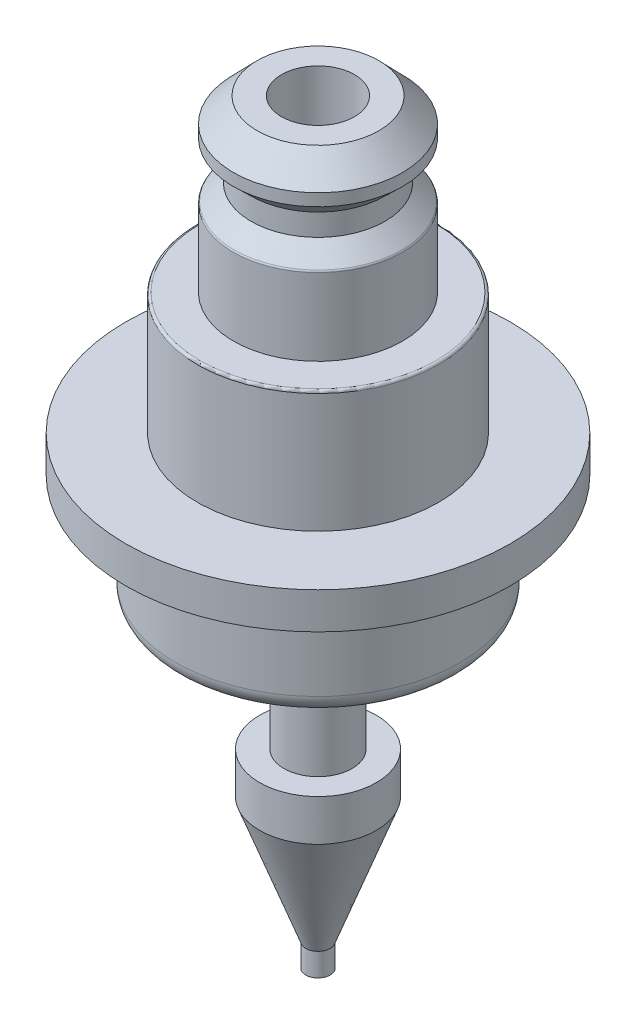
ISO-10303-21;
HEADER;
FILE_DESCRIPTION(('STEP AP214'),'2;1');
FILE_NAME('part.step','',(''),(''),'','','');
FILE_SCHEMA(('AUTOMOTIVE_DESIGN { 1 0 10303 214 1 1 1 1 }'));
ENDSEC;
DATA;
#1=APPLICATION_CONTEXT('core data for automotive mechanical design processes');
#2=APPLICATION_PROTOCOL_DEFINITION('international standard','automotive_design',2000,#1);
#3=PRODUCT_CONTEXT('',#1,'mechanical');
#4=PRODUCT('Part','Part','',(#3));
#5=PRODUCT_RELATED_PRODUCT_CATEGORY('part','',(#4));
#6=PRODUCT_DEFINITION_FORMATION('','',#4);
#7=PRODUCT_DEFINITION_CONTEXT('part definition',#1,'design');
#8=PRODUCT_DEFINITION('design','',#6,#7);
#9=PRODUCT_DEFINITION_SHAPE('','',#8);
#10=(LENGTH_UNIT() NAMED_UNIT(*) SI_UNIT(.MILLI.,.METRE.));
#11=(NAMED_UNIT(*) PLANE_ANGLE_UNIT() SI_UNIT($,.RADIAN.));
#12=(NAMED_UNIT(*) SI_UNIT($,.STERADIAN.) SOLID_ANGLE_UNIT());
#13=UNCERTAINTY_MEASURE_WITH_UNIT(LENGTH_MEASURE(1.E-05),#10,'distance_accuracy_value','');
#14=(GEOMETRIC_REPRESENTATION_CONTEXT(3) GLOBAL_UNCERTAINTY_ASSIGNED_CONTEXT((#13)) GLOBAL_UNIT_ASSIGNED_CONTEXT((#10,
#11,#12)) REPRESENTATION_CONTEXT('',''));
#15=CARTESIAN_POINT('',(0.,0.,0.));
#16=DIRECTION('',(0.,0.,1.));
#17=DIRECTION('',(1.,0.,0.));
#18=AXIS2_PLACEMENT_3D('',#15,#16,#17);
#19=CARTESIAN_POINT('',(0.,13.5,0.));
#20=DIRECTION('',(0.,-1.,0.));
#21=DIRECTION('',(1.,0.,0.));
#22=AXIS2_PLACEMENT_3D('',#19,#20,#21);
#23=CYLINDRICAL_SURFACE('',#22,2.39999999999999);
#24=CARTESIAN_POINT('',(0.,-9.75000000000001,0.));
#25=DIRECTION('',(0.,-1.,0.));
#26=DIRECTION('',(1.,0.,0.));
#27=AXIS2_PLACEMENT_3D('',#24,#25,#26);
#28=CIRCLE('',#27,2.39999999999999);
#29=CARTESIAN_POINT('',(2.39999999999999,-9.75000000000001,0.));
#30=VERTEX_POINT('',#29);
#31=EDGE_CURVE('E47',#30,#30,#28,.T.);
#32=ORIENTED_EDGE('',*,*,#31,.T.);
#33=EDGE_LOOP('',(#32));
#34=FACE_BOUND('',#33,.T.);
#35=CARTESIAN_POINT('',(0.,-11.45,0.));
#36=DIRECTION('',(0.,-1.,0.));
#37=DIRECTION('',(1.,0.,0.));
#38=AXIS2_PLACEMENT_3D('',#35,#36,#37);
#39=CIRCLE('',#38,2.39999999999999);
#40=CARTESIAN_POINT('',(-2.39999999999998,-11.45,0.));
#41=VERTEX_POINT('',#40);
#42=EDGE_CURVE('E117',#41,#41,#39,.T.);
#43=ORIENTED_EDGE('',*,*,#42,.F.);
#44=EDGE_LOOP('',(#43));
#45=FACE_BOUND('',#44,.T.);
#46=ADVANCED_FACE('F41',(#34,#45),#23,.T.);
#47=CARTESIAN_POINT('',(2.39999999999999,-9.75000000000001,0.));
#48=DIRECTION('',(0.,1.,0.));
#49=DIRECTION('',(-1.,0.,0.));
#50=AXIS2_PLACEMENT_3D('',#47,#48,#49);
#51=PLANE('',#50);
#52=CARTESIAN_POINT('',(0.,-9.75000000000001,0.));
#53=DIRECTION('',(0.,-1.,0.));
#54=DIRECTION('',(1.,0.,0.));
#55=AXIS2_PLACEMENT_3D('',#52,#53,#54);
#56=CIRCLE('',#55,1.4);
#57=CARTESIAN_POINT('',(1.4,-9.75000000000001,0.));
#58=VERTEX_POINT('',#57);
#59=EDGE_CURVE('E51',#58,#58,#56,.T.);
#60=ORIENTED_EDGE('',*,*,#59,.T.);
#61=EDGE_LOOP('',(#60));
#62=FACE_BOUND('',#61,.T.);
#63=ORIENTED_EDGE('',*,*,#31,.F.);
#64=EDGE_LOOP('',(#63));
#65=FACE_BOUND('',#64,.T.);
#66=ADVANCED_FACE('F146',(#62,#65),#51,.T.);
#67=CARTESIAN_POINT('',(0.,13.5,0.));
#68=DIRECTION('',(0.,-1.,0.));
#69=DIRECTION('',(1.,0.,0.));
#70=AXIS2_PLACEMENT_3D('',#67,#68,#69);
#71=CYLINDRICAL_SURFACE('',#70,1.4);
#72=CARTESIAN_POINT('',(0.,-4.5,0.));
#73=DIRECTION('',(0.,-1.,0.));
#74=DIRECTION('',(1.,0.,0.));
#75=AXIS2_PLACEMENT_3D('',#72,#73,#74);
#76=CIRCLE('',#75,1.4);
#77=CARTESIAN_POINT('',(1.4,-4.5,0.));
#78=VERTEX_POINT('',#77);
#79=EDGE_CURVE('E55',#78,#78,#76,.T.);
#80=ORIENTED_EDGE('',*,*,#79,.T.);
#81=EDGE_LOOP('',(#80));
#82=FACE_BOUND('',#81,.T.);
#83=ORIENTED_EDGE('',*,*,#59,.F.);
#84=EDGE_LOOP('',(#83));
#85=FACE_BOUND('',#84,.T.);
#86=ADVANCED_FACE('F150',(#82,#85),#71,.T.);
#87=CARTESIAN_POINT('',(1.4,-4.5,0.));
#88=DIRECTION('',(0.,-1.,0.));
#89=DIRECTION('',(1.,0.,0.));
#90=AXIS2_PLACEMENT_3D('',#87,#88,#89);
#91=PLANE('',#90);
#92=CARTESIAN_POINT('',(0.,-4.5,0.));
#93=DIRECTION('',(0.,-1.,0.));
#94=DIRECTION('',(1.,0.,0.));
#95=AXIS2_PLACEMENT_3D('',#92,#93,#94);
#96=CIRCLE('',#95,5.1);
#97=CARTESIAN_POINT('',(5.1,-4.5,0.));
#98=VERTEX_POINT('',#97);
#99=EDGE_CURVE('E60',#98,#98,#96,.T.);
#100=ORIENTED_EDGE('',*,*,#99,.T.);
#101=EDGE_LOOP('',(#100));
#102=FACE_BOUND('',#101,.T.);
#103=ORIENTED_EDGE('',*,*,#79,.F.);
#104=EDGE_LOOP('',(#103));
#105=FACE_BOUND('',#104,.T.);
#106=ADVANCED_FACE('F158',(#102,#105),#91,.T.);
#107=CARTESIAN_POINT('',(0.,-3.75,0.));
#108=DIRECTION('',(0.,-1.,0.));
#109=DIRECTION('',(1.,0.,0.));
#110=AXIS2_PLACEMENT_3D('',#107,#108,#109);
#111=TOROIDAL_SURFACE('',#110,5.1,0.75);
#112=CARTESIAN_POINT('',(0.,-3.75,0.));
#113=DIRECTION('',(0.,-1.,0.));
#114=DIRECTION('',(1.,0.,0.));
#115=AXIS2_PLACEMENT_3D('',#112,#113,#114);
#116=CIRCLE('',#115,5.85);
#117=CARTESIAN_POINT('',(5.85,-3.75,0.));
#118=VERTEX_POINT('',#117);
#119=EDGE_CURVE('E63',#118,#118,#116,.T.);
#120=ORIENTED_EDGE('',*,*,#119,.T.);
#121=EDGE_LOOP('',(#120));
#122=FACE_BOUND('',#121,.T.);
#123=ORIENTED_EDGE('',*,*,#99,.F.);
#124=EDGE_LOOP('',(#123));
#125=FACE_BOUND('',#124,.T.);
#126=ADVANCED_FACE('F165',(#122,#125),#111,.T.);
#127=CARTESIAN_POINT('',(0.,13.5,0.));
#128=DIRECTION('',(0.,-1.,0.));
#129=DIRECTION('',(1.,0.,0.));
#130=AXIS2_PLACEMENT_3D('',#127,#128,#129);
#131=CYLINDRICAL_SURFACE('',#130,5.85);
#132=CARTESIAN_POINT('',(0.,0.,0.));
#133=DIRECTION('',(0.,-1.,0.));
#134=DIRECTION('',(1.,0.,0.));
#135=AXIS2_PLACEMENT_3D('',#132,#133,#134);
#136=CIRCLE('',#135,5.85);
#137=CARTESIAN_POINT('',(5.85,0.,0.));
#138=VERTEX_POINT('',#137);
#139=EDGE_CURVE('E66',#138,#138,#136,.T.);
#140=ORIENTED_EDGE('',*,*,#139,.T.);
#141=EDGE_LOOP('',(#140));
#142=FACE_BOUND('',#141,.T.);
#143=ORIENTED_EDGE('',*,*,#119,.F.);
#144=EDGE_LOOP('',(#143));
#145=FACE_BOUND('',#144,.T.);
#146=ADVANCED_FACE('F169',(#142,#145),#131,.T.);
#147=CARTESIAN_POINT('',(5.85,0.,0.));
#148=DIRECTION('',(0.,-1.,0.));
#149=DIRECTION('',(1.,0.,0.));
#150=AXIS2_PLACEMENT_3D('',#147,#148,#149);
#151=PLANE('',#150);
#152=CARTESIAN_POINT('',(0.,0.,0.));
#153=DIRECTION('',(0.,-1.,0.));
#154=DIRECTION('',(1.,0.,0.));
#155=AXIS2_PLACEMENT_3D('',#152,#153,#154);
#156=CIRCLE('',#155,7.9);
#157=CARTESIAN_POINT('',(7.9,0.,0.));
#158=VERTEX_POINT('',#157);
#159=EDGE_CURVE('E69',#158,#158,#156,.T.);
#160=ORIENTED_EDGE('',*,*,#159,.T.);
#161=EDGE_LOOP('',(#160));
#162=FACE_BOUND('',#161,.T.);
#163=ORIENTED_EDGE('',*,*,#139,.F.);
#164=EDGE_LOOP('',(#163));
#165=FACE_BOUND('',#164,.T.);
#166=ADVANCED_FACE('F173',(#162,#165),#151,.T.);
#167=CARTESIAN_POINT('',(0.,13.5,0.));
#168=DIRECTION('',(0.,-1.,0.));
#169=DIRECTION('',(1.,0.,0.));
#170=AXIS2_PLACEMENT_3D('',#167,#168,#169);
#171=CYLINDRICAL_SURFACE('',#170,7.9);
#172=CARTESIAN_POINT('',(0.,1.5,0.));
#173=DIRECTION('',(0.,-1.,0.));
#174=DIRECTION('',(1.,0.,0.));
#175=AXIS2_PLACEMENT_3D('',#172,#173,#174);
#176=CIRCLE('',#175,7.9);
#177=CARTESIAN_POINT('',(7.9,1.5,0.));
#178=VERTEX_POINT('',#177);
#179=EDGE_CURVE('E72',#178,#178,#176,.T.);
#180=ORIENTED_EDGE('',*,*,#179,.T.);
#181=EDGE_LOOP('',(#180));
#182=FACE_BOUND('',#181,.T.);
#183=ORIENTED_EDGE('',*,*,#159,.F.);
#184=EDGE_LOOP('',(#183));
#185=FACE_BOUND('',#184,.T.);
#186=ADVANCED_FACE('F177',(#182,#185),#171,.T.);
#187=CARTESIAN_POINT('',(7.9,1.5,0.));
#188=DIRECTION('',(0.,1.,0.));
#189=DIRECTION('',(-1.,0.,0.));
#190=AXIS2_PLACEMENT_3D('',#187,#188,#189);
#191=PLANE('',#190);
#192=CARTESIAN_POINT('',(0.,1.5,0.));
#193=DIRECTION('',(0.,-1.,0.));
#194=DIRECTION('',(1.,0.,0.));
#195=AXIS2_PLACEMENT_3D('',#192,#193,#194);
#196=CIRCLE('',#195,4.955);
#197=CARTESIAN_POINT('',(4.955,1.5,0.));
#198=VERTEX_POINT('',#197);
#199=EDGE_CURVE('E75',#198,#198,#196,.T.);
#200=ORIENTED_EDGE('',*,*,#199,.T.);
#201=EDGE_LOOP('',(#200));
#202=FACE_BOUND('',#201,.T.);
#203=ORIENTED_EDGE('',*,*,#179,.F.);
#204=EDGE_LOOP('',(#203));
#205=FACE_BOUND('',#204,.T.);
#206=ADVANCED_FACE('F181',(#202,#205),#191,.T.);
#207=CARTESIAN_POINT('',(0.,13.5,0.));
#208=DIRECTION('',(0.,-1.,0.));
#209=DIRECTION('',(1.,0.,0.));
#210=AXIS2_PLACEMENT_3D('',#207,#208,#209);
#211=CYLINDRICAL_SURFACE('',#210,4.955);
#212=CARTESIAN_POINT('',(0.,6.4,0.));
#213=DIRECTION('',(0.,-1.,0.));
#214=DIRECTION('',(1.,0.,0.));
#215=AXIS2_PLACEMENT_3D('',#212,#213,#214);
#216=CIRCLE('',#215,4.955);
#217=CARTESIAN_POINT('',(4.955,6.4,0.));
#218=VERTEX_POINT('',#217);
#219=EDGE_CURVE('E78',#218,#218,#216,.T.);
#220=ORIENTED_EDGE('',*,*,#219,.T.);
#221=EDGE_LOOP('',(#220));
#222=FACE_BOUND('',#221,.T.);
#223=ORIENTED_EDGE('',*,*,#199,.F.);
#224=EDGE_LOOP('',(#223));
#225=FACE_BOUND('',#224,.T.);
#226=ADVANCED_FACE('F185',(#222,#225),#211,.T.);
#227=CARTESIAN_POINT('',(0.,6.4,0.));
#228=DIRECTION('',(0.,-1.,0.));
#229=DIRECTION('',(1.,0.,0.));
#230=AXIS2_PLACEMENT_3D('',#227,#228,#229);
#231=TOROIDAL_SURFACE('',#230,4.855,0.0999999999999998);
#232=CARTESIAN_POINT('',(0.,6.5,0.));
#233=DIRECTION('',(0.,-1.,0.));
#234=DIRECTION('',(1.,0.,0.));
#235=AXIS2_PLACEMENT_3D('',#232,#233,#234);
#236=CIRCLE('',#235,4.855);
#237=CARTESIAN_POINT('',(4.855,6.5,0.));
#238=VERTEX_POINT('',#237);
#239=EDGE_CURVE('E81',#238,#238,#236,.T.);
#240=ORIENTED_EDGE('',*,*,#239,.T.);
#241=EDGE_LOOP('',(#240));
#242=FACE_BOUND('',#241,.T.);
#243=ORIENTED_EDGE('',*,*,#219,.F.);
#244=EDGE_LOOP('',(#243));
#245=FACE_BOUND('',#244,.T.);
#246=ADVANCED_FACE('F189',(#242,#245),#231,.T.);
#247=CARTESIAN_POINT('',(4.855,6.5,0.));
#248=DIRECTION('',(0.,1.,0.));
#249=DIRECTION('',(-1.,0.,0.));
#250=AXIS2_PLACEMENT_3D('',#247,#248,#249);
#251=PLANE('',#250);
#252=CARTESIAN_POINT('',(0.,6.5,0.));
#253=DIRECTION('',(0.,-1.,0.));
#254=DIRECTION('',(1.,0.,0.));
#255=AXIS2_PLACEMENT_3D('',#252,#253,#254);
#256=CIRCLE('',#255,3.47499999999999);
#257=CARTESIAN_POINT('',(3.47499999999999,6.5,0.));
#258=VERTEX_POINT('',#257);
#259=EDGE_CURVE('E84',#258,#258,#256,.T.);
#260=ORIENTED_EDGE('',*,*,#259,.T.);
#261=EDGE_LOOP('',(#260));
#262=FACE_BOUND('',#261,.T.);
#263=ORIENTED_EDGE('',*,*,#239,.F.);
#264=EDGE_LOOP('',(#263));
#265=FACE_BOUND('',#264,.T.);
#266=ADVANCED_FACE('F193',(#262,#265),#251,.T.);
#267=CARTESIAN_POINT('',(0.,13.5,0.));
#268=DIRECTION('',(0.,-1.,0.));
#269=DIRECTION('',(1.,0.,0.));
#270=AXIS2_PLACEMENT_3D('',#267,#268,#269);
#271=CYLINDRICAL_SURFACE('',#270,3.47499999999999);
#272=CARTESIAN_POINT('',(0.,9.65754728020174,0.));
#273=DIRECTION('',(0.,-1.,0.));
#274=DIRECTION('',(1.,0.,0.));
#275=AXIS2_PLACEMENT_3D('',#272,#273,#274);
#276=CIRCLE('',#275,3.47499999999999);
#277=CARTESIAN_POINT('',(3.47499999999999,9.65754728020174,0.));
#278=VERTEX_POINT('',#277);
#279=EDGE_CURVE('E87',#278,#278,#276,.T.);
#280=ORIENTED_EDGE('',*,*,#279,.T.);
#281=EDGE_LOOP('',(#280));
#282=FACE_BOUND('',#281,.T.);
#283=ORIENTED_EDGE('',*,*,#259,.F.);
#284=EDGE_LOOP('',(#283));
#285=FACE_BOUND('',#284,.T.);
#286=ADVANCED_FACE('F197',(#282,#285),#271,.T.);
#287=CARTESIAN_POINT('',(0.,9.65754728020174,0.));
#288=DIRECTION('',(0.,-1.,0.));
#289=DIRECTION('',(1.,0.,0.));
#290=AXIS2_PLACEMENT_3D('',#287,#288,#289);
#291=TOROIDAL_SURFACE('',#290,3.37499999999997,0.100000000000022);
#292=CARTESIAN_POINT('',(0.,9.72948742626349,0.));
#293=DIRECTION('',(0.,-1.,0.));
#294=DIRECTION('',(1.,0.,0.));
#295=AXIS2_PLACEMENT_3D('',#292,#293,#294);
#296=CIRCLE('',#295,3.44445945136994);
#297=CARTESIAN_POINT('',(3.44445945136994,9.72948742626349,0.));
#298=VERTEX_POINT('',#297);
#299=EDGE_CURVE('E90',#298,#298,#296,.T.);
#300=ORIENTED_EDGE('',*,*,#299,.T.);
#301=EDGE_LOOP('',(#300));
#302=FACE_BOUND('',#301,.T.);
#303=ORIENTED_EDGE('',*,*,#279,.F.);
#304=EDGE_LOOP('',(#303));
#305=FACE_BOUND('',#304,.T.);
#306=ADVANCED_FACE('F201',(#302,#305),#291,.T.);
#307=CARTESIAN_POINT('',(0.,9.72948742626349,0.));
#308=DIRECTION('',(0.,-1.,0.));
#309=DIRECTION('',(1.,0.,0.));
#310=AXIS2_PLACEMENT_3D('',#307,#308,#309);
#311=CONICAL_SURFACE('',#310,3.44445945136994,0.802940223454833);
#312=CARTESIAN_POINT('',(0.,10.4,0.));
#313=DIRECTION('',(0.,-1.,0.));
#314=DIRECTION('',(1.,0.,0.));
#315=AXIS2_PLACEMENT_3D('',#312,#313,#314);
#316=CIRCLE('',#315,2.75000000000001);
#317=CARTESIAN_POINT('',(2.75000000000001,10.4,0.));
#318=VERTEX_POINT('',#317);
#319=EDGE_CURVE('E93',#318,#318,#316,.T.);
#320=ORIENTED_EDGE('',*,*,#319,.T.);
#321=EDGE_LOOP('',(#320));
#322=FACE_BOUND('',#321,.T.);
#323=ORIENTED_EDGE('',*,*,#299,.F.);
#324=EDGE_LOOP('',(#323));
#325=FACE_BOUND('',#324,.T.);
#326=ADVANCED_FACE('F205',(#322,#325),#311,.T.);
#327=CARTESIAN_POINT('',(0.,13.5,0.));
#328=DIRECTION('',(0.,-1.,0.));
#329=DIRECTION('',(1.,0.,0.));
#330=AXIS2_PLACEMENT_3D('',#327,#328,#329);
#331=CYLINDRICAL_SURFACE('',#330,2.75000000000001);
#332=CARTESIAN_POINT('',(0.,11.3,0.));
#333=DIRECTION('',(0.,-1.,0.));
#334=DIRECTION('',(1.,0.,0.));
#335=AXIS2_PLACEMENT_3D('',#332,#333,#334);
#336=CIRCLE('',#335,2.75000000000001);
#337=CARTESIAN_POINT('',(2.75000000000001,11.3,0.));
#338=VERTEX_POINT('',#337);
#339=EDGE_CURVE('E96',#338,#338,#336,.T.);
#340=ORIENTED_EDGE('',*,*,#339,.T.);
#341=EDGE_LOOP('',(#340));
#342=FACE_BOUND('',#341,.T.);
#343=ORIENTED_EDGE('',*,*,#319,.F.);
#344=EDGE_LOOP('',(#343));
#345=FACE_BOUND('',#344,.T.);
#346=ADVANCED_FACE('F209',(#342,#345),#331,.T.);
#347=CARTESIAN_POINT('',(0.,11.3,0.));
#348=DIRECTION('',(0.,1.,0.));
#349=DIRECTION('',(-1.,0.,0.));
#350=AXIS2_PLACEMENT_3D('',#347,#348,#349);
#351=CONICAL_SURFACE('',#350,2.75000000000001,0.802940223454837);
#352=CARTESIAN_POINT('',(0.,12.,0.));
#353=DIRECTION('',(0.,-1.,0.));
#354=DIRECTION('',(1.,0.,0.));
#355=AXIS2_PLACEMENT_3D('',#352,#353,#354);
#356=CIRCLE('',#355,3.47499999999999);
#357=CARTESIAN_POINT('',(3.47499999999999,12.,0.));
#358=VERTEX_POINT('',#357);
#359=EDGE_CURVE('E99',#358,#358,#356,.T.);
#360=ORIENTED_EDGE('',*,*,#359,.T.);
#361=EDGE_LOOP('',(#360));
#362=FACE_BOUND('',#361,.T.);
#363=ORIENTED_EDGE('',*,*,#339,.F.);
#364=EDGE_LOOP('',(#363));
#365=FACE_BOUND('',#364,.T.);
#366=ADVANCED_FACE('F213',(#362,#365),#351,.T.);
#367=CARTESIAN_POINT('',(0.,13.5,0.));
#368=DIRECTION('',(0.,-1.,0.));
#369=DIRECTION('',(1.,0.,0.));
#370=AXIS2_PLACEMENT_3D('',#367,#368,#369);
#371=CYLINDRICAL_SURFACE('',#370,3.47499999999999);
#372=CARTESIAN_POINT('',(0.,12.5,0.));
#373=DIRECTION('',(0.,-1.,0.));
#374=DIRECTION('',(1.,0.,0.));
#375=AXIS2_PLACEMENT_3D('',#372,#373,#374);
#376=CIRCLE('',#375,3.47499999999999);
#377=CARTESIAN_POINT('',(3.47499999999999,12.5,0.));
#378=VERTEX_POINT('',#377);
#379=EDGE_CURVE('E102',#378,#378,#376,.T.);
#380=ORIENTED_EDGE('',*,*,#379,.T.);
#381=EDGE_LOOP('',(#380));
#382=FACE_BOUND('',#381,.T.);
#383=ORIENTED_EDGE('',*,*,#359,.F.);
#384=EDGE_LOOP('',(#383));
#385=FACE_BOUND('',#384,.T.);
#386=ADVANCED_FACE('F217',(#382,#385),#371,.T.);
#387=CARTESIAN_POINT('',(0.,12.5,0.));
#388=DIRECTION('',(0.,-1.,0.));
#389=DIRECTION('',(1.,0.,0.));
#390=AXIS2_PLACEMENT_3D('',#387,#388,#389);
#391=CONICAL_SURFACE('',#390,3.47499999999999,0.77274061156339);
#392=CARTESIAN_POINT('',(0.,13.5,0.));
#393=DIRECTION('',(0.,-1.,0.));
#394=DIRECTION('',(1.,0.,0.));
#395=AXIS2_PLACEMENT_3D('',#392,#393,#394);
#396=CIRCLE('',#395,2.5);
#397=CARTESIAN_POINT('',(2.5,13.5,0.));
#398=VERTEX_POINT('',#397);
#399=EDGE_CURVE('E105',#398,#398,#396,.T.);
#400=ORIENTED_EDGE('',*,*,#399,.T.);
#401=EDGE_LOOP('',(#400));
#402=FACE_BOUND('',#401,.T.);
#403=ORIENTED_EDGE('',*,*,#379,.F.);
#404=EDGE_LOOP('',(#403));
#405=FACE_BOUND('',#404,.T.);
#406=ADVANCED_FACE('F221',(#402,#405),#391,.T.);
#407=CARTESIAN_POINT('',(2.5,13.5,0.));
#408=DIRECTION('',(0.,1.,0.));
#409=DIRECTION('',(-1.,0.,0.));
#410=AXIS2_PLACEMENT_3D('',#407,#408,#409);
#411=PLANE('',#410);
#412=CARTESIAN_POINT('',(0.,13.5,0.));
#413=DIRECTION('',(0.,-1.,0.));
#414=DIRECTION('',(1.,0.,0.));
#415=AXIS2_PLACEMENT_3D('',#412,#413,#414);
#416=CIRCLE('',#415,1.5);
#417=CARTESIAN_POINT('',(1.5,13.5,0.));
#418=VERTEX_POINT('',#417);
#419=EDGE_CURVE('E108',#418,#418,#416,.T.);
#420=ORIENTED_EDGE('',*,*,#419,.T.);
#421=EDGE_LOOP('',(#420));
#422=FACE_BOUND('',#421,.T.);
#423=ORIENTED_EDGE('',*,*,#399,.F.);
#424=EDGE_LOOP('',(#423));
#425=FACE_BOUND('',#424,.T.);
#426=ADVANCED_FACE('F225',(#422,#425),#411,.T.);
#427=CARTESIAN_POINT('',(0.,13.5,0.));
#428=DIRECTION('',(0.,-1.,0.));
#429=DIRECTION('',(1.,0.,0.));
#430=AXIS2_PLACEMENT_3D('',#427,#428,#429);
#431=CYLINDRICAL_SURFACE('',#430,1.5);
#432=CARTESIAN_POINT('',(0.,0.,0.));
#433=DIRECTION('',(0.,-1.,0.));
#434=DIRECTION('',(1.,0.,0.));
#435=AXIS2_PLACEMENT_3D('',#432,#433,#434);
#436=CIRCLE('',#435,1.5);
#437=CARTESIAN_POINT('',(1.5,0.,0.));
#438=VERTEX_POINT('',#437);
#439=EDGE_CURVE('E111',#438,#438,#436,.T.);
#440=ORIENTED_EDGE('',*,*,#439,.T.);
#441=EDGE_LOOP('',(#440));
#442=FACE_BOUND('',#441,.T.);
#443=ORIENTED_EDGE('',*,*,#419,.F.);
#444=EDGE_LOOP('',(#443));
#445=FACE_BOUND('',#444,.T.);
#446=ADVANCED_FACE('F229',(#442,#445),#431,.F.);
#447=CARTESIAN_POINT('',(1.5,0.,0.));
#448=DIRECTION('',(0.,1.,0.));
#449=DIRECTION('',(-1.,0.,0.));
#450=AXIS2_PLACEMENT_3D('',#447,#448,#449);
#451=PLANE('',#450);
#452=CARTESIAN_POINT('',(0.,0.,0.));
#453=DIRECTION('',(0.,-1.,0.));
#454=DIRECTION('',(1.,0.,0.));
#455=AXIS2_PLACEMENT_3D('',#452,#453,#454);
#456=CIRCLE('',#455,0.149999999999996);
#457=CARTESIAN_POINT('',(0.15,0.,0.));
#458=VERTEX_POINT('',#457);
#459=EDGE_CURVE('E114',#458,#458,#456,.T.);
#460=ORIENTED_EDGE('',*,*,#459,.T.);
#461=EDGE_LOOP('',(#460));
#462=FACE_BOUND('',#461,.T.);
#463=ORIENTED_EDGE('',*,*,#439,.F.);
#464=EDGE_LOOP('',(#463));
#465=FACE_BOUND('',#464,.T.);
#466=ADVANCED_FACE('F233',(#462,#465),#451,.T.);
#467=CARTESIAN_POINT('',(0.,13.5,0.));
#468=DIRECTION('',(0.,-1.,0.));
#469=DIRECTION('',(1.,0.,0.));
#470=AXIS2_PLACEMENT_3D('',#467,#468,#469);
#471=CYLINDRICAL_SURFACE('',#470,0.149999999999994);
#472=CARTESIAN_POINT('',(0.,-17.55,0.));
#473=DIRECTION('',(0.,-1.,0.));
#474=DIRECTION('',(0.,0.,-1.));
#475=AXIS2_PLACEMENT_3D('',#472,#473,#474);
#476=CIRCLE('',#475,0.149999999999993);
#477=CARTESIAN_POINT('',(0.,-17.55,-0.149999999999993));
#478=VERTEX_POINT('',#477);
#479=EDGE_CURVE('E123',#478,#478,#476,.T.);
#480=ORIENTED_EDGE('',*,*,#479,.T.);
#481=EDGE_LOOP('',(#480));
#482=FACE_BOUND('',#481,.T.);
#483=ORIENTED_EDGE('',*,*,#459,.F.);
#484=EDGE_LOOP('',(#483));
#485=FACE_BOUND('',#484,.T.);
#486=ADVANCED_FACE('F127',(#482,#485),#471,.F.);
#487=CARTESIAN_POINT('',(0.,-17.55,0.));
#488=DIRECTION('',(0.,1.,0.));
#489=DIRECTION('',(-1.,0.,0.));
#490=AXIS2_PLACEMENT_3D('',#487,#488,#489);
#491=CONICAL_SURFACE('',#490,0.149999999999993,0.353370182719397);
#492=CARTESIAN_POINT('',(0.,-16.6011111111111,0.));
#493=DIRECTION('',(0.,1.,0.));
#494=DIRECTION('',(-1.,0.,0.));
#495=AXIS2_PLACEMENT_3D('',#492,#493,#494);
#496=CIRCLE('',#495,0.5);
#497=CARTESIAN_POINT('',(-0.499999999999993,-16.6011111111111,0.));
#498=VERTEX_POINT('',#497);
#499=EDGE_CURVE('E10',#498,#498,#496,.F.);
#500=CARTESIAN_POINT('',(-0.499999999999993,-16.6011111111111,0.));
#501=CARTESIAN_POINT('',(-0.51979166666666,-16.5474537037037,0.));
#502=CARTESIAN_POINT('',(-0.539583333333326,-16.4937962962963,0.));
#503=CARTESIAN_POINT('',(-0.579166666666659,-16.3864814814815,0.));
#504=CARTESIAN_POINT('',(-0.598958333333326,-16.3328240740741,0.));
#505=CARTESIAN_POINT('',(-0.638541666666659,-16.2255092592592,0.));
#506=CARTESIAN_POINT('',(-0.658333333333326,-16.1718518518518,0.));
#507=CARTESIAN_POINT('',(-0.697916666666659,-16.064537037037,0.));
#508=CARTESIAN_POINT('',(-0.717708333333325,-16.0108796296296,0.));
#509=CARTESIAN_POINT('',(-0.757291666666658,-15.9035648148148,0.));
#510=CARTESIAN_POINT('',(-0.777083333333325,-15.8499074074074,0.));
#511=CARTESIAN_POINT('',(-0.816666666666658,-15.7425925925926,0.));
#512=CARTESIAN_POINT('',(-0.836458333333325,-15.6889351851852,0.));
#513=CARTESIAN_POINT('',(-0.876041666666658,-15.5816203703704,0.));
#514=CARTESIAN_POINT('',(-0.895833333333324,-15.527962962963,0.));
#515=CARTESIAN_POINT('',(-0.935416666666657,-15.4206481481481,0.));
#516=CARTESIAN_POINT('',(-0.955208333333324,-15.3669907407407,0.));
#517=CARTESIAN_POINT('',(-0.994791666666657,-15.2596759259259,0.));
#518=CARTESIAN_POINT('',(-1.01458333333332,-15.2060185185185,0.));
#519=CARTESIAN_POINT('',(-1.05416666666666,-15.0987037037037,0.));
#520=CARTESIAN_POINT('',(-1.07395833333332,-15.0450462962963,0.));
#521=CARTESIAN_POINT('',(-1.11354166666666,-14.9377314814815,0.));
#522=CARTESIAN_POINT('',(-1.13333333333332,-14.8840740740741,0.));
#523=CARTESIAN_POINT('',(-1.17291666666666,-14.7767592592593,0.));
#524=CARTESIAN_POINT('',(-1.19270833333332,-14.7231018518518,0.));
#525=CARTESIAN_POINT('',(-1.23229166666666,-14.615787037037,0.));
#526=CARTESIAN_POINT('',(-1.25208333333332,-14.5621296296296,0.));
#527=CARTESIAN_POINT('',(-1.29166666666665,-14.4548148148148,0.));
#528=CARTESIAN_POINT('',(-1.31145833333332,-14.4011574074074,0.));
#529=CARTESIAN_POINT('',(-1.35104166666665,-14.2938425925926,0.));
#530=CARTESIAN_POINT('',(-1.37083333333332,-14.2401851851852,0.));
#531=CARTESIAN_POINT('',(-1.41041666666665,-14.1328703703704,0.));
#532=CARTESIAN_POINT('',(-1.43020833333332,-14.079212962963,0.));
#533=CARTESIAN_POINT('',(-1.46979166666665,-13.9718981481481,0.));
#534=CARTESIAN_POINT('',(-1.48958333333332,-13.9182407407407,0.));
#535=CARTESIAN_POINT('',(-1.52916666666665,-13.8109259259259,0.));
#536=CARTESIAN_POINT('',(-1.54895833333332,-13.7572685185185,0.));
#537=CARTESIAN_POINT('',(-1.58854166666665,-13.6499537037037,0.));
#538=CARTESIAN_POINT('',(-1.60833333333332,-13.5962962962963,0.));
#539=CARTESIAN_POINT('',(-1.64791666666665,-13.4889814814815,0.));
#540=CARTESIAN_POINT('',(-1.66770833333332,-13.4353240740741,0.));
#541=CARTESIAN_POINT('',(-1.70729166666665,-13.3280092592593,0.));
#542=CARTESIAN_POINT('',(-1.72708333333332,-13.2743518518518,0.));
#543=CARTESIAN_POINT('',(-1.76666666666665,-13.167037037037,0.));
#544=CARTESIAN_POINT('',(-1.78645833333332,-13.1133796296296,0.));
#545=CARTESIAN_POINT('',(-1.82604166666665,-13.0060648148148,0.));
#546=CARTESIAN_POINT('',(-1.84583333333332,-12.9524074074074,0.));
#547=CARTESIAN_POINT('',(-1.88541666666665,-12.8450925925926,0.));
#548=CARTESIAN_POINT('',(-1.90520833333332,-12.7914351851852,0.));
#549=CARTESIAN_POINT('',(-1.94479166666665,-12.6841203703704,0.));
#550=CARTESIAN_POINT('',(-1.96458333333332,-12.630462962963,0.));
#551=CARTESIAN_POINT('',(-2.00416666666665,-12.5231481481481,0.));
#552=CARTESIAN_POINT('',(-2.02395833333332,-12.4694907407407,0.));
#553=CARTESIAN_POINT('',(-2.06354166666665,-12.3621759259259,0.));
#554=CARTESIAN_POINT('',(-2.08333333333332,-12.3085185185185,0.));
#555=CARTESIAN_POINT('',(-2.12291666666665,-12.2012037037037,0.));
#556=CARTESIAN_POINT('',(-2.14270833333332,-12.1475462962963,0.));
#557=CARTESIAN_POINT('',(-2.18229166666665,-12.0402314814815,0.));
#558=CARTESIAN_POINT('',(-2.20208333333332,-11.9865740740741,0.));
#559=CARTESIAN_POINT('',(-2.24166666666665,-11.8792592592593,0.));
#560=CARTESIAN_POINT('',(-2.26145833333332,-11.8256018518519,0.));
#561=CARTESIAN_POINT('',(-2.30104166666665,-11.718287037037,0.));
#562=CARTESIAN_POINT('',(-2.32083333333332,-11.6646296296296,0.));
#563=CARTESIAN_POINT('',(-2.36041666666665,-11.5573148148148,0.));
#564=CARTESIAN_POINT('',(-2.38020833333332,-11.5036574074074,0.));
#565=CARTESIAN_POINT('',(-2.39999999999998,-11.45,0.));
#566=B_SPLINE_CURVE_WITH_KNOTS('',3,(#500,#501,#502,#503,#504,#505,#506,#507,#508,#509,#510,
#511,#512,#513,#514,#515,#516,#517,#518,#519,#520,#521,#522,#523,#524,#525,#526,#527,#528,#529,
#530,#531,#532,#533,#534,#535,#536,#537,#538,#539,#540,#541,#542,#543,#544,#545,#546,#547,#548,
#549,#550,#551,#552,#553,#554,#555,#556,#557,#558,#559,#560,#561,#562,#563,#564,#565),
.UNSPECIFIED.,.F.,.F.,(4,2,2,2,2,2,2,2,2,2,2,2,2,2,2,2,2,2,2,2,2,2,2,2,2,2,2,2,2,2,2,2,4),(0.,
0.171573444775584,0.343146889551168,0.514720334326752,0.686293779102336,0.857867223877921,
1.0294406686535,1.20101411342909,1.37258755820467,1.54416100298025,1.71573444775584,
1.88730789253142,2.058881337307,2.23045478208259,2.40202822685817,2.57360167163375,
2.74517511640934,2.91674856118492,3.0883220059605,3.25989545073609,3.43146889551167,
3.60304234028725,3.77461578506284,3.94618922983842,4.117762674614,4.28933611938959,
4.46090956416517,4.63248300894076,4.80405645371634,4.97562989849192,5.14720334326751,
5.31877678804309,5.49035023281867),.UNSPECIFIED.);
#567=EDGE_CURVE('BSEAM138',#498,#41,#566,.T.);
#568=ORIENTED_EDGE('',*,*,#499,.F.);
#569=ORIENTED_EDGE('',*,*,#42,.T.);
#570=ORIENTED_EDGE('',*,*,#567,.T.);
#571=ORIENTED_EDGE('',*,*,#567,.F.);
#572=EDGE_LOOP('',(#568,#570,#569,#571));
#573=FACE_BOUND('',#572,.T.);
#574=ADVANCED_FACE('F138',(#573),#491,.T.);
#575=CARTESIAN_POINT('',(0.,-16.55,0.));
#576=DIRECTION('',(0.,-1.,0.));
#577=DIRECTION('',(0.,0.,-1.));
#578=AXIS2_PLACEMENT_3D('',#575,#576,#577);
#579=CYLINDRICAL_SURFACE('',#578,0.5);
#580=ORIENTED_EDGE('',*,*,#499,.T.);
#581=EDGE_LOOP('',(#580));
#582=FACE_BOUND('',#581,.T.);
#583=CARTESIAN_POINT('',(0.,-17.55,0.));
#584=DIRECTION('',(0.,-1.,0.));
#585=DIRECTION('',(0.,0.,-1.));
#586=AXIS2_PLACEMENT_3D('',#583,#584,#585);
#587=CIRCLE('',#586,0.5);
#588=CARTESIAN_POINT('',(0.,-17.55,-0.5));
#589=VERTEX_POINT('',#588);
#590=EDGE_CURVE('E120',#589,#589,#587,.T.);
#591=ORIENTED_EDGE('',*,*,#590,.F.);
#592=EDGE_LOOP('',(#591));
#593=FACE_BOUND('',#592,.T.);
#594=ADVANCED_FACE('F133',(#582,#593),#579,.T.);
#595=CARTESIAN_POINT('',(0.,-17.55,0.));
#596=DIRECTION('',(0.,-1.,0.));
#597=DIRECTION('',(0.,0.,-1.));
#598=AXIS2_PLACEMENT_3D('',#595,#596,#597);
#599=PLANE('',#598);
#600=ORIENTED_EDGE('',*,*,#479,.F.);
#601=EDGE_LOOP('',(#600));
#602=FACE_BOUND('',#601,.T.);
#603=ORIENTED_EDGE('',*,*,#590,.T.);
#604=EDGE_LOOP('',(#603));
#605=FACE_BOUND('',#604,.T.);
#606=ADVANCED_FACE('F130',(#602,#605),#599,.T.);
#607=CLOSED_SHELL('',(#46,#66,#86,#106,#126,#146,#166,#186,#206,#226,#246,#266,#286,#306,#326,
#346,#366,#386,#406,#426,#446,#466,#486,#574,#594,#606));
#608=MANIFOLD_SOLID_BREP('B2',#607);
#609=ADVANCED_BREP_SHAPE_REPRESENTATION('',(#18,#608),#14);
#610=SHAPE_DEFINITION_REPRESENTATION(#9,#609);
ENDSEC;
END-ISO-10303-21;
